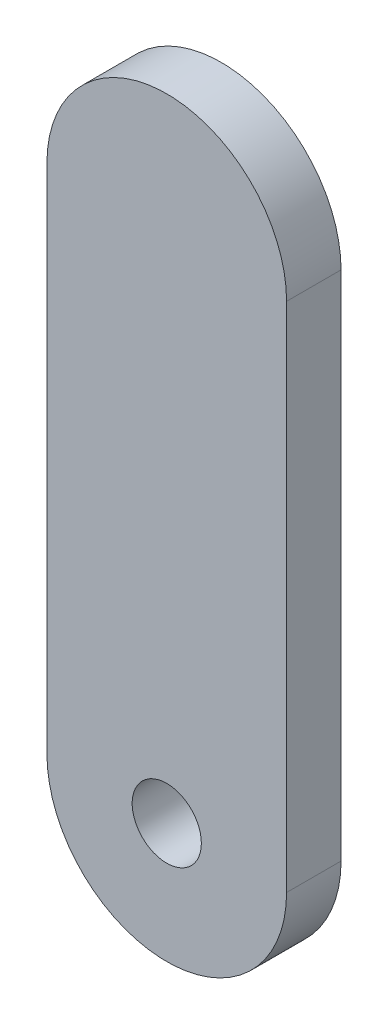
ISO-10303-21;
HEADER;
FILE_DESCRIPTION(('STEP AP214'),'2;1');
FILE_NAME('part.step','',(''),(''),'','','');
FILE_SCHEMA(('AUTOMOTIVE_DESIGN { 1 0 10303 214 1 1 1 1 }'));
ENDSEC;
DATA;
#1=APPLICATION_CONTEXT('core data for automotive mechanical design processes');
#2=APPLICATION_PROTOCOL_DEFINITION('international standard','automotive_design',2000,#1);
#3=PRODUCT_CONTEXT('',#1,'mechanical');
#4=PRODUCT('Part','Part','',(#3));
#5=PRODUCT_RELATED_PRODUCT_CATEGORY('part','',(#4));
#6=PRODUCT_DEFINITION_FORMATION('','',#4);
#7=PRODUCT_DEFINITION_CONTEXT('part definition',#1,'design');
#8=PRODUCT_DEFINITION('design','',#6,#7);
#9=PRODUCT_DEFINITION_SHAPE('','',#8);
#10=(LENGTH_UNIT() NAMED_UNIT(*) SI_UNIT(.MILLI.,.METRE.));
#11=(NAMED_UNIT(*) PLANE_ANGLE_UNIT() SI_UNIT($,.RADIAN.));
#12=(NAMED_UNIT(*) SI_UNIT($,.STERADIAN.) SOLID_ANGLE_UNIT());
#13=UNCERTAINTY_MEASURE_WITH_UNIT(LENGTH_MEASURE(1.E-05),#10,'distance_accuracy_value','');
#14=(GEOMETRIC_REPRESENTATION_CONTEXT(3) GLOBAL_UNCERTAINTY_ASSIGNED_CONTEXT((#13)) GLOBAL_UNIT_ASSIGNED_CONTEXT((#10,
#11,#12)) REPRESENTATION_CONTEXT('',''));
#15=CARTESIAN_POINT('',(0.,0.,0.));
#16=DIRECTION('',(0.,0.,1.));
#17=DIRECTION('',(1.,0.,0.));
#18=AXIS2_PLACEMENT_3D('',#15,#16,#17);
#19=CARTESIAN_POINT('',(0.,0.,5.));
#20=DIRECTION('',(0.,0.,1.));
#21=DIRECTION('',(1.,0.,0.));
#22=AXIS2_PLACEMENT_3D('',#19,#20,#21);
#23=PLANE('',#22);
#24=CARTESIAN_POINT('',(0.,0.,5.));
#25=DIRECTION('',(0.,0.,1.));
#26=DIRECTION('',(1.,0.,0.));
#27=AXIS2_PLACEMENT_3D('',#24,#25,#26);
#28=CIRCLE('',#27,11.);
#29=CARTESIAN_POINT('',(-11.,0.,5.));
#30=VERTEX_POINT('',#29);
#31=CARTESIAN_POINT('',(11.,0.,5.));
#32=VERTEX_POINT('',#31);
#33=EDGE_CURVE('E94',#30,#32,#28,.T.);
#34=ORIENTED_EDGE('',*,*,#33,.T.);
#35=DIRECTION('',(0.,1.,0.));
#36=VECTOR('',#35,1.);
#37=CARTESIAN_POINT('',(11.,0.,5.));
#38=LINE('',#37,#36);
#39=CARTESIAN_POINT('',(11.,47.,5.));
#40=VERTEX_POINT('',#39);
#41=EDGE_CURVE('E89',#32,#40,#38,.T.);
#42=ORIENTED_EDGE('',*,*,#41,.T.);
#43=CARTESIAN_POINT('',(0.,47.,5.));
#44=DIRECTION('',(0.,0.,1.));
#45=DIRECTION('',(1.,0.,0.));
#46=AXIS2_PLACEMENT_3D('',#43,#44,#45);
#47=CIRCLE('',#46,11.);
#48=CARTESIAN_POINT('',(-11.,47.,5.));
#49=VERTEX_POINT('',#48);
#50=EDGE_CURVE('E93',#40,#49,#47,.T.);
#51=ORIENTED_EDGE('',*,*,#50,.T.);
#52=DIRECTION('',(0.,-1.,0.));
#53=VECTOR('',#52,1.);
#54=CARTESIAN_POINT('',(-11.,47.,5.));
#55=LINE('',#54,#53);
#56=EDGE_CURVE('E58',#49,#30,#55,.T.);
#57=ORIENTED_EDGE('',*,*,#56,.T.);
#58=EDGE_LOOP('',(#34,#42,#51,#57));
#59=FACE_BOUND('',#58,.T.);
#60=CARTESIAN_POINT('',(0.,0.,5.));
#61=DIRECTION('',(0.,0.,1.));
#62=DIRECTION('',(1.,0.,0.));
#63=AXIS2_PLACEMENT_3D('',#60,#61,#62);
#64=CIRCLE('',#63,3.175);
#65=CARTESIAN_POINT('',(3.175,0.,5.));
#66=VERTEX_POINT('',#65);
#67=EDGE_CURVE('E106',#66,#66,#64,.T.);
#68=ORIENTED_EDGE('',*,*,#67,.F.);
#69=EDGE_LOOP('',(#68));
#70=FACE_BOUND('',#69,.T.);
#71=ADVANCED_FACE('F43',(#59,#70),#23,.T.);
#72=CARTESIAN_POINT('',(0.,0.,0.));
#73=DIRECTION('',(0.,0.,1.));
#74=DIRECTION('',(1.,0.,0.));
#75=AXIS2_PLACEMENT_3D('',#72,#73,#74);
#76=PLANE('',#75);
#77=CARTESIAN_POINT('',(0.,0.,0.));
#78=DIRECTION('',(0.,0.,1.));
#79=DIRECTION('',(1.,0.,0.));
#80=AXIS2_PLACEMENT_3D('',#77,#78,#79);
#81=CIRCLE('',#80,11.);
#82=CARTESIAN_POINT('',(-11.,0.,0.));
#83=VERTEX_POINT('',#82);
#84=CARTESIAN_POINT('',(11.,0.,0.));
#85=VERTEX_POINT('',#84);
#86=EDGE_CURVE('E110',#83,#85,#81,.T.);
#87=ORIENTED_EDGE('',*,*,#86,.F.);
#88=DIRECTION('',(0.,-1.,0.));
#89=VECTOR('',#88,1.);
#90=CARTESIAN_POINT('',(-11.,47.,0.));
#91=LINE('',#90,#89);
#92=CARTESIAN_POINT('',(-11.,47.,0.));
#93=VERTEX_POINT('',#92);
#94=EDGE_CURVE('E81',#93,#83,#91,.T.);
#95=ORIENTED_EDGE('',*,*,#94,.F.);
#96=CARTESIAN_POINT('',(0.,47.,0.));
#97=DIRECTION('',(0.,0.,1.));
#98=DIRECTION('',(1.,0.,0.));
#99=AXIS2_PLACEMENT_3D('',#96,#97,#98);
#100=CIRCLE('',#99,11.);
#101=CARTESIAN_POINT('',(11.,47.,0.));
#102=VERTEX_POINT('',#101);
#103=EDGE_CURVE('E77',#102,#93,#100,.T.);
#104=ORIENTED_EDGE('',*,*,#103,.F.);
#105=DIRECTION('',(0.,1.,0.));
#106=VECTOR('',#105,1.);
#107=CARTESIAN_POINT('',(11.,0.,0.));
#108=LINE('',#107,#106);
#109=EDGE_CURVE('E98',#85,#102,#108,.T.);
#110=ORIENTED_EDGE('',*,*,#109,.F.);
#111=EDGE_LOOP('',(#87,#95,#104,#110));
#112=FACE_BOUND('',#111,.T.);
#113=CARTESIAN_POINT('',(0.,0.,0.));
#114=DIRECTION('',(0.,0.,1.));
#115=DIRECTION('',(1.,0.,0.));
#116=AXIS2_PLACEMENT_3D('',#113,#114,#115);
#117=CIRCLE('',#116,3.175);
#118=CARTESIAN_POINT('',(3.175,0.,0.));
#119=VERTEX_POINT('',#118);
#120=EDGE_CURVE('E122',#119,#119,#117,.T.);
#121=ORIENTED_EDGE('',*,*,#120,.T.);
#122=EDGE_LOOP('',(#121));
#123=FACE_BOUND('',#122,.T.);
#124=ADVANCED_FACE('F118',(#112,#123),#76,.F.);
#125=CARTESIAN_POINT('',(0.,0.,5.));
#126=DIRECTION('',(0.,0.,-1.));
#127=DIRECTION('',(-1.,0.,0.));
#128=AXIS2_PLACEMENT_3D('',#125,#126,#127);
#129=CYLINDRICAL_SURFACE('',#128,11.);
#130=ORIENTED_EDGE('',*,*,#86,.T.);
#131=DIRECTION('',(0.,0.,-1.));
#132=VECTOR('',#131,1.);
#133=CARTESIAN_POINT('',(11.,0.,5.));
#134=LINE('',#133,#132);
#135=EDGE_CURVE('E11',#32,#85,#134,.T.);
#136=ORIENTED_EDGE('',*,*,#135,.F.);
#137=ORIENTED_EDGE('',*,*,#33,.F.);
#138=DIRECTION('',(0.,0.,-1.));
#139=VECTOR('',#138,1.);
#140=CARTESIAN_POINT('',(-11.,0.,5.));
#141=LINE('',#140,#139);
#142=EDGE_CURVE('E104',#30,#83,#141,.T.);
#143=ORIENTED_EDGE('',*,*,#142,.T.);
#144=EDGE_LOOP('',(#130,#136,#137,#143));
#145=FACE_BOUND('',#144,.T.);
#146=ADVANCED_FACE('F44',(#145),#129,.T.);
#147=CARTESIAN_POINT('',(11.,0.,5.));
#148=DIRECTION('',(-1.,0.,0.));
#149=DIRECTION('',(0.,0.,1.));
#150=AXIS2_PLACEMENT_3D('',#147,#148,#149);
#151=PLANE('',#150);
#152=ORIENTED_EDGE('',*,*,#109,.T.);
#153=DIRECTION('',(0.,0.,-1.));
#154=VECTOR('',#153,1.);
#155=CARTESIAN_POINT('',(11.,47.,5.));
#156=LINE('',#155,#154);
#157=EDGE_CURVE('E55',#40,#102,#156,.T.);
#158=ORIENTED_EDGE('',*,*,#157,.F.);
#159=ORIENTED_EDGE('',*,*,#41,.F.);
#160=ORIENTED_EDGE('',*,*,#135,.T.);
#161=EDGE_LOOP('',(#152,#158,#159,#160));
#162=FACE_BOUND('',#161,.T.);
#163=ADVANCED_FACE('F97',(#162),#151,.F.);
#164=CARTESIAN_POINT('',(0.,47.,5.));
#165=DIRECTION('',(0.,0.,-1.));
#166=DIRECTION('',(-1.,0.,0.));
#167=AXIS2_PLACEMENT_3D('',#164,#165,#166);
#168=CYLINDRICAL_SURFACE('',#167,11.);
#169=ORIENTED_EDGE('',*,*,#103,.T.);
#170=DIRECTION('',(0.,0.,-1.));
#171=VECTOR('',#170,1.);
#172=CARTESIAN_POINT('',(-11.,47.,5.));
#173=LINE('',#172,#171);
#174=EDGE_CURVE('E99',#49,#93,#173,.T.);
#175=ORIENTED_EDGE('',*,*,#174,.F.);
#176=ORIENTED_EDGE('',*,*,#50,.F.);
#177=ORIENTED_EDGE('',*,*,#157,.T.);
#178=EDGE_LOOP('',(#169,#175,#176,#177));
#179=FACE_BOUND('',#178,.T.);
#180=ADVANCED_FACE('F102',(#179),#168,.T.);
#181=CARTESIAN_POINT('',(-11.,47.,5.));
#182=DIRECTION('',(1.,0.,0.));
#183=DIRECTION('',(0.,0.,-1.));
#184=AXIS2_PLACEMENT_3D('',#181,#182,#183);
#185=PLANE('',#184);
#186=ORIENTED_EDGE('',*,*,#94,.T.);
#187=ORIENTED_EDGE('',*,*,#142,.F.);
#188=ORIENTED_EDGE('',*,*,#56,.F.);
#189=ORIENTED_EDGE('',*,*,#174,.T.);
#190=EDGE_LOOP('',(#186,#187,#188,#189));
#191=FACE_BOUND('',#190,.T.);
#192=ADVANCED_FACE('F113',(#191),#185,.F.);
#193=CARTESIAN_POINT('',(0.,0.,5.));
#194=DIRECTION('',(0.,0.,-1.));
#195=DIRECTION('',(-1.,0.,0.));
#196=AXIS2_PLACEMENT_3D('',#193,#194,#195);
#197=CYLINDRICAL_SURFACE('',#196,3.175);
#198=ORIENTED_EDGE('',*,*,#67,.T.);
#199=EDGE_LOOP('',(#198));
#200=FACE_BOUND('',#199,.T.);
#201=ORIENTED_EDGE('',*,*,#120,.F.);
#202=EDGE_LOOP('',(#201));
#203=FACE_BOUND('',#202,.T.);
#204=ADVANCED_FACE('F126',(#200,#203),#197,.F.);
#205=CLOSED_SHELL('',(#71,#124,#146,#163,#180,#192,#204));
#206=MANIFOLD_SOLID_BREP('B2',#205);
#207=ADVANCED_BREP_SHAPE_REPRESENTATION('',(#18,#206),#14);
#208=SHAPE_DEFINITION_REPRESENTATION(#9,#207);
ENDSEC;
END-ISO-10303-21;
